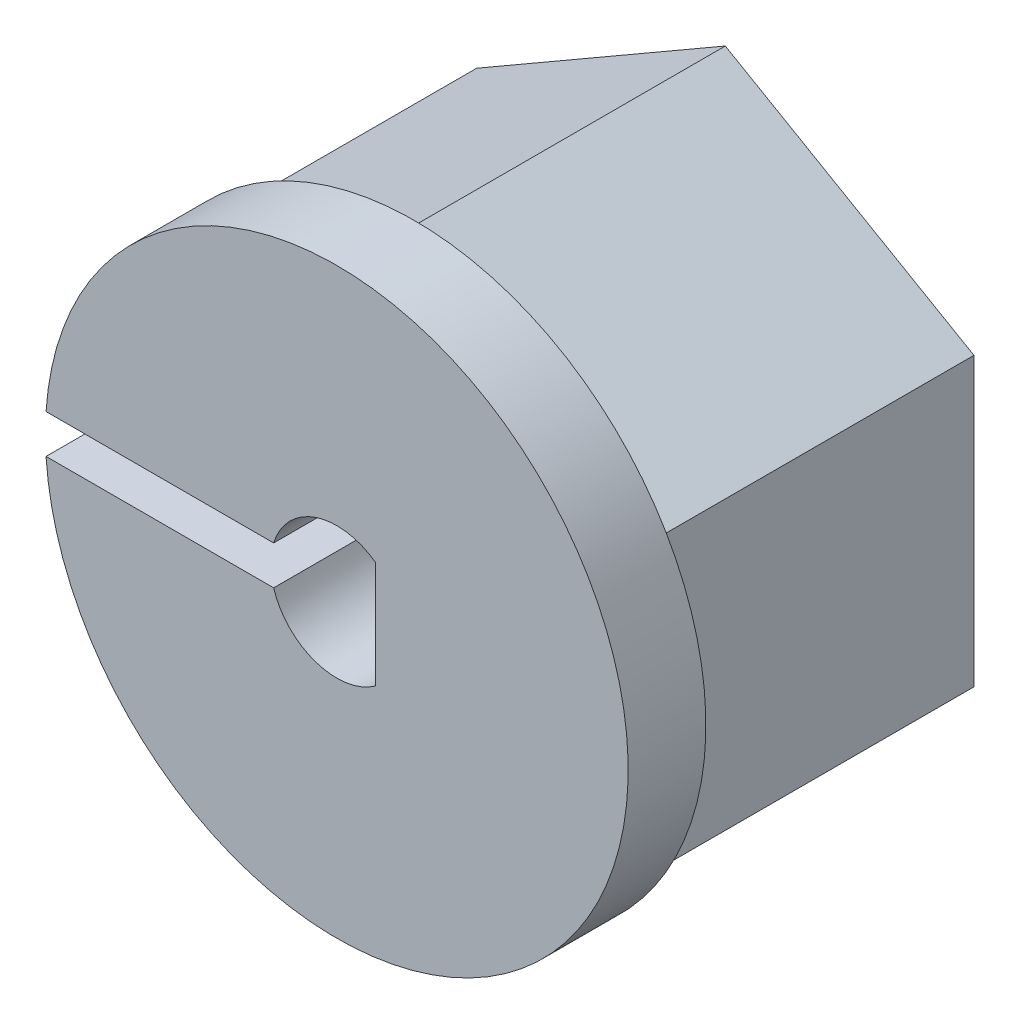
ISO-10303-21;
HEADER;
FILE_DESCRIPTION(('STEP AP214'),'2;1');
FILE_NAME('part.step','',(''),(''),'','','');
FILE_SCHEMA(('AUTOMOTIVE_DESIGN { 1 0 10303 214 1 1 1 1 }'));
ENDSEC;
DATA;
#1=APPLICATION_CONTEXT('core data for automotive mechanical design processes');
#2=APPLICATION_PROTOCOL_DEFINITION('international standard','automotive_design',2000,#1);
#3=PRODUCT_CONTEXT('',#1,'mechanical');
#4=PRODUCT('Part','Part','',(#3));
#5=PRODUCT_RELATED_PRODUCT_CATEGORY('part','',(#4));
#6=PRODUCT_DEFINITION_FORMATION('','',#4);
#7=PRODUCT_DEFINITION_CONTEXT('part definition',#1,'design');
#8=PRODUCT_DEFINITION('design','',#6,#7);
#9=PRODUCT_DEFINITION_SHAPE('','',#8);
#10=(LENGTH_UNIT() NAMED_UNIT(*) SI_UNIT(.MILLI.,.METRE.));
#11=(NAMED_UNIT(*) PLANE_ANGLE_UNIT() SI_UNIT($,.RADIAN.));
#12=(NAMED_UNIT(*) SI_UNIT($,.STERADIAN.) SOLID_ANGLE_UNIT());
#13=UNCERTAINTY_MEASURE_WITH_UNIT(LENGTH_MEASURE(1.E-05),#10,'distance_accuracy_value','');
#14=(GEOMETRIC_REPRESENTATION_CONTEXT(3) GLOBAL_UNCERTAINTY_ASSIGNED_CONTEXT((#13)) GLOBAL_UNIT_ASSIGNED_CONTEXT((#10,
#11,#12)) REPRESENTATION_CONTEXT('',''));
#15=CARTESIAN_POINT('',(0.,0.,0.));
#16=DIRECTION('',(0.,0.,1.));
#17=DIRECTION('',(1.,0.,0.));
#18=AXIS2_PLACEMENT_3D('',#15,#16,#17);
#19=CARTESIAN_POINT('',(-6.4,3.69504172281361,8.));
#20=DIRECTION('',(1.,0.,0.));
#21=DIRECTION('',(0.,1.,0.));
#22=AXIS2_PLACEMENT_3D('',#19,#20,#21);
#23=PLANE('',#22);
#24=DIRECTION('',(0.,-1.,0.));
#25=VECTOR('',#24,1.);
#26=CARTESIAN_POINT('',(-6.4,3.69504172281361,0.));
#27=LINE('',#26,#25);
#28=CARTESIAN_POINT('',(-6.4,3.69504172281361,0.));
#29=VERTEX_POINT('',#28);
#30=CARTESIAN_POINT('',(-6.4,0.5,0.));
#31=VERTEX_POINT('',#30);
#32=EDGE_CURVE('E142',#29,#31,#27,.T.);
#33=ORIENTED_EDGE('',*,*,#32,.T.);
#34=DIRECTION('',(0.,0.,-1.));
#35=VECTOR('',#34,1.);
#36=CARTESIAN_POINT('',(-6.4,0.5,10.001));
#37=LINE('',#36,#35);
#38=CARTESIAN_POINT('',(-6.4,0.5,8.));
#39=VERTEX_POINT('',#38);
#40=EDGE_CURVE('E257',#39,#31,#37,.T.);
#41=ORIENTED_EDGE('',*,*,#40,.F.);
#42=DIRECTION('',(0.,-1.,0.));
#43=VECTOR('',#42,1.);
#44=CARTESIAN_POINT('',(-6.4,3.69504172281361,8.));
#45=LINE('',#44,#43);
#46=CARTESIAN_POINT('',(-6.4,3.69504172281361,8.));
#47=VERTEX_POINT('',#46);
#48=EDGE_CURVE('E114',#47,#39,#45,.T.);
#49=ORIENTED_EDGE('',*,*,#48,.F.);
#50=DIRECTION('',(0.,0.,-1.));
#51=VECTOR('',#50,1.);
#52=CARTESIAN_POINT('',(-6.4,3.69504172281361,8.));
#53=LINE('',#52,#51);
#54=EDGE_CURVE('E40',#47,#29,#53,.T.);
#55=ORIENTED_EDGE('',*,*,#54,.T.);
#56=EDGE_LOOP('',(#33,#41,#49,#55));
#57=FACE_BOUND('',#56,.T.);
#58=ADVANCED_FACE('F32',(#57),#23,.F.);
#59=CARTESIAN_POINT('',(6.4,3.69504172281361,8.));
#60=DIRECTION('',(-0.5,-0.866025403784439,0.));
#61=DIRECTION('',(0.866025403784439,-0.5,0.));
#62=AXIS2_PLACEMENT_3D('',#59,#60,#61);
#63=PLANE('',#62);
#64=DIRECTION('',(-0.866025403784439,0.5,0.));
#65=VECTOR('',#64,1.);
#66=CARTESIAN_POINT('',(6.4,3.69504172281361,0.));
#67=LINE('',#66,#65);
#68=CARTESIAN_POINT('',(6.4,3.69504172281361,0.));
#69=VERTEX_POINT('',#68);
#70=CARTESIAN_POINT('',(0.,7.39008344562721,0.));
#71=VERTEX_POINT('',#70);
#72=EDGE_CURVE('E136',#69,#71,#67,.T.);
#73=ORIENTED_EDGE('',*,*,#72,.T.);
#74=DIRECTION('',(0.,0.,-1.));
#75=VECTOR('',#74,1.);
#76=CARTESIAN_POINT('',(0.,7.39008344562721,8.));
#77=LINE('',#76,#75);
#78=CARTESIAN_POINT('',(0.,7.39008344562721,8.));
#79=VERTEX_POINT('',#78);
#80=EDGE_CURVE('E11',#79,#71,#77,.T.);
#81=ORIENTED_EDGE('',*,*,#80,.F.);
#82=DIRECTION('',(-0.866025403784439,0.5,0.));
#83=VECTOR('',#82,1.);
#84=CARTESIAN_POINT('',(6.4,3.69504172281361,8.));
#85=LINE('',#84,#83);
#86=CARTESIAN_POINT('',(6.4,3.69504172281361,8.));
#87=VERTEX_POINT('',#86);
#88=EDGE_CURVE('E150',#87,#79,#85,.T.);
#89=ORIENTED_EDGE('',*,*,#88,.F.);
#90=DIRECTION('',(0.,0.,-1.));
#91=VECTOR('',#90,1.);
#92=CARTESIAN_POINT('',(6.4,3.69504172281361,8.));
#93=LINE('',#92,#91);
#94=EDGE_CURVE('E135',#87,#69,#93,.T.);
#95=ORIENTED_EDGE('',*,*,#94,.T.);
#96=EDGE_LOOP('',(#73,#81,#89,#95));
#97=FACE_BOUND('',#96,.T.);
#98=ADVANCED_FACE('F34',(#97),#63,.F.);
#99=CARTESIAN_POINT('',(0.,7.39008344562721,8.));
#100=DIRECTION('',(0.5,-0.866025403784439,0.));
#101=DIRECTION('',(0.866025403784439,0.5,0.));
#102=AXIS2_PLACEMENT_3D('',#99,#100,#101);
#103=PLANE('',#102);
#104=DIRECTION('',(-0.866025403784439,-0.5,0.));
#105=VECTOR('',#104,1.);
#106=CARTESIAN_POINT('',(0.,7.39008344562721,0.));
#107=LINE('',#106,#105);
#108=EDGE_CURVE('E139',#71,#29,#107,.T.);
#109=ORIENTED_EDGE('',*,*,#108,.T.);
#110=ORIENTED_EDGE('',*,*,#54,.F.);
#111=DIRECTION('',(-0.866025403784439,-0.5,0.));
#112=VECTOR('',#111,1.);
#113=CARTESIAN_POINT('',(0.,7.39008344562721,8.));
#114=LINE('',#113,#112);
#115=EDGE_CURVE('E91',#79,#47,#114,.T.);
#116=ORIENTED_EDGE('',*,*,#115,.F.);
#117=ORIENTED_EDGE('',*,*,#80,.T.);
#118=EDGE_LOOP('',(#109,#110,#116,#117));
#119=FACE_BOUND('',#118,.T.);
#120=ADVANCED_FACE('F296',(#119),#103,.F.);
#121=CARTESIAN_POINT('',(-6.4,-0.5,8.));
#122=VERTEX_POINT('',#121);
#123=CARTESIAN_POINT('',(-6.4,-3.6950417228136,8.));
#124=VERTEX_POINT('',#123);
#125=EDGE_CURVE('E101',#122,#124,#45,.T.);
#126=ORIENTED_EDGE('',*,*,#125,.F.);
#127=DIRECTION('',(0.,0.,1.));
#128=VECTOR('',#127,1.);
#129=CARTESIAN_POINT('',(-6.4,-0.5,10.001));
#130=LINE('',#129,#128);
#131=CARTESIAN_POINT('',(-6.4,-0.5,0.));
#132=VERTEX_POINT('',#131);
#133=EDGE_CURVE('E275',#132,#122,#130,.T.);
#134=ORIENTED_EDGE('',*,*,#133,.F.);
#135=CARTESIAN_POINT('',(-6.4,-3.6950417228136,0.));
#136=VERTEX_POINT('',#135);
#137=EDGE_CURVE('E120',#132,#136,#27,.T.);
#138=ORIENTED_EDGE('',*,*,#137,.T.);
#139=DIRECTION('',(0.,0.,-1.));
#140=VECTOR('',#139,1.);
#141=CARTESIAN_POINT('',(-6.4,-3.6950417228136,8.));
#142=LINE('',#141,#140);
#143=EDGE_CURVE('E117',#124,#136,#142,.T.);
#144=ORIENTED_EDGE('',*,*,#143,.F.);
#145=EDGE_LOOP('',(#126,#134,#138,#144));
#146=FACE_BOUND('',#145,.T.);
#147=ADVANCED_FACE('F118',(#146),#23,.F.);
#148=CARTESIAN_POINT('',(-6.4,-3.6950417228136,8.));
#149=DIRECTION('',(0.5,0.866025403784439,0.));
#150=DIRECTION('',(-0.866025403784439,0.5,0.));
#151=AXIS2_PLACEMENT_3D('',#148,#149,#150);
#152=PLANE('',#151);
#153=DIRECTION('',(0.866025403784439,-0.5,0.));
#154=VECTOR('',#153,1.);
#155=CARTESIAN_POINT('',(-6.4,-3.6950417228136,0.));
#156=LINE('',#155,#154);
#157=CARTESIAN_POINT('',(0.,-7.39008344562721,0.));
#158=VERTEX_POINT('',#157);
#159=EDGE_CURVE('E145',#136,#158,#156,.T.);
#160=ORIENTED_EDGE('',*,*,#159,.T.);
#161=DIRECTION('',(0.,0.,-1.));
#162=VECTOR('',#161,1.);
#163=CARTESIAN_POINT('',(0.,-7.39008344562721,8.));
#164=LINE('',#163,#162);
#165=CARTESIAN_POINT('',(0.,-7.39008344562721,8.));
#166=VERTEX_POINT('',#165);
#167=EDGE_CURVE('E123',#166,#158,#164,.T.);
#168=ORIENTED_EDGE('',*,*,#167,.F.);
#169=DIRECTION('',(0.866025403784439,-0.5,0.));
#170=VECTOR('',#169,1.);
#171=CARTESIAN_POINT('',(-6.4,-3.6950417228136,8.));
#172=LINE('',#171,#170);
#173=EDGE_CURVE('E107',#124,#166,#172,.T.);
#174=ORIENTED_EDGE('',*,*,#173,.F.);
#175=ORIENTED_EDGE('',*,*,#143,.T.);
#176=EDGE_LOOP('',(#160,#168,#174,#175));
#177=FACE_BOUND('',#176,.T.);
#178=ADVANCED_FACE('F125',(#177),#152,.F.);
#179=CARTESIAN_POINT('',(0.,-7.39008344562721,8.));
#180=DIRECTION('',(-0.5,0.866025403784439,0.));
#181=DIRECTION('',(-0.866025403784439,-0.5,0.));
#182=AXIS2_PLACEMENT_3D('',#179,#180,#181);
#183=PLANE('',#182);
#184=DIRECTION('',(0.866025403784439,0.5,0.));
#185=VECTOR('',#184,1.);
#186=CARTESIAN_POINT('',(0.,-7.39008344562721,0.));
#187=LINE('',#186,#185);
#188=CARTESIAN_POINT('',(6.4,-3.69504172281361,0.));
#189=VERTEX_POINT('',#188);
#190=EDGE_CURVE('E147',#158,#189,#187,.T.);
#191=ORIENTED_EDGE('',*,*,#190,.T.);
#192=DIRECTION('',(0.,0.,-1.));
#193=VECTOR('',#192,1.);
#194=CARTESIAN_POINT('',(6.4,-3.69504172281361,8.));
#195=LINE('',#194,#193);
#196=CARTESIAN_POINT('',(6.4,-3.69504172281361,8.));
#197=VERTEX_POINT('',#196);
#198=EDGE_CURVE('E56',#197,#189,#195,.T.);
#199=ORIENTED_EDGE('',*,*,#198,.F.);
#200=DIRECTION('',(0.866025403784439,0.5,0.));
#201=VECTOR('',#200,1.);
#202=CARTESIAN_POINT('',(0.,-7.39008344562721,8.));
#203=LINE('',#202,#201);
#204=EDGE_CURVE('E127',#166,#197,#203,.T.);
#205=ORIENTED_EDGE('',*,*,#204,.F.);
#206=ORIENTED_EDGE('',*,*,#167,.T.);
#207=EDGE_LOOP('',(#191,#199,#205,#206));
#208=FACE_BOUND('',#207,.T.);
#209=ADVANCED_FACE('F217',(#208),#183,.F.);
#210=CARTESIAN_POINT('',(6.4,-3.69504172281361,8.));
#211=DIRECTION('',(-1.,0.,0.));
#212=DIRECTION('',(0.,-1.,0.));
#213=AXIS2_PLACEMENT_3D('',#210,#211,#212);
#214=PLANE('',#213);
#215=DIRECTION('',(0.,1.,0.));
#216=VECTOR('',#215,1.);
#217=CARTESIAN_POINT('',(6.4,-3.69504172281361,0.));
#218=LINE('',#217,#216);
#219=EDGE_CURVE('E83',#189,#69,#218,.T.);
#220=ORIENTED_EDGE('',*,*,#219,.T.);
#221=ORIENTED_EDGE('',*,*,#94,.F.);
#222=DIRECTION('',(0.,1.,0.));
#223=VECTOR('',#222,1.);
#224=CARTESIAN_POINT('',(6.4,-3.69504172281361,8.));
#225=LINE('',#224,#223);
#226=EDGE_CURVE('E129',#197,#87,#225,.T.);
#227=ORIENTED_EDGE('',*,*,#226,.F.);
#228=ORIENTED_EDGE('',*,*,#198,.T.);
#229=EDGE_LOOP('',(#220,#221,#227,#228));
#230=FACE_BOUND('',#229,.T.);
#231=ADVANCED_FACE('F216',(#230),#214,.F.);
#232=CARTESIAN_POINT('',(0.,0.,0.));
#233=DIRECTION('',(0.,0.,1.));
#234=DIRECTION('',(1.,0.,0.));
#235=AXIS2_PLACEMENT_3D('',#232,#233,#234);
#236=PLANE('',#235);
#237=CARTESIAN_POINT('',(0.,0.,0.));
#238=DIRECTION('',(0.,0.,-1.));
#239=DIRECTION('',(-1.,0.,0.));
#240=AXIS2_PLACEMENT_3D('',#237,#238,#239);
#241=CIRCLE('',#240,1.7);
#242=CARTESIAN_POINT('',(-1.62480768092719,0.5,0.));
#243=VERTEX_POINT('',#242);
#244=CARTESIAN_POINT('',(1.,1.37477270848675,0.));
#245=VERTEX_POINT('',#244);
#246=EDGE_CURVE('E169',#243,#245,#241,.T.);
#247=ORIENTED_EDGE('',*,*,#246,.F.);
#248=DIRECTION('',(1.,0.,0.));
#249=VECTOR('',#248,1.);
#250=CARTESIAN_POINT('',(-1.62480768092719,0.5,0.));
#251=LINE('',#250,#249);
#252=EDGE_CURVE('E165',#31,#243,#251,.T.);
#253=ORIENTED_EDGE('',*,*,#252,.F.);
#254=ORIENTED_EDGE('',*,*,#32,.F.);
#255=ORIENTED_EDGE('',*,*,#108,.F.);
#256=ORIENTED_EDGE('',*,*,#72,.F.);
#257=ORIENTED_EDGE('',*,*,#219,.F.);
#258=ORIENTED_EDGE('',*,*,#190,.F.);
#259=ORIENTED_EDGE('',*,*,#159,.F.);
#260=ORIENTED_EDGE('',*,*,#137,.F.);
#261=DIRECTION('',(-1.,0.,0.));
#262=VECTOR('',#261,1.);
#263=CARTESIAN_POINT('',(-1.62480768092719,-0.5,0.));
#264=LINE('',#263,#262);
#265=CARTESIAN_POINT('',(-1.62480768092719,-0.5,0.));
#266=VERTEX_POINT('',#265);
#267=EDGE_CURVE('E176',#266,#132,#264,.T.);
#268=ORIENTED_EDGE('',*,*,#267,.F.);
#269=CARTESIAN_POINT('',(0.,0.,0.));
#270=DIRECTION('',(0.,0.,-1.));
#271=DIRECTION('',(-1.,0.,0.));
#272=AXIS2_PLACEMENT_3D('',#269,#270,#271);
#273=CIRCLE('',#272,1.7);
#274=CARTESIAN_POINT('',(1.,-1.37477270848675,0.));
#275=VERTEX_POINT('',#274);
#276=EDGE_CURVE('E181',#275,#266,#273,.T.);
#277=ORIENTED_EDGE('',*,*,#276,.F.);
#278=DIRECTION('',(0.,-1.,0.));
#279=VECTOR('',#278,1.);
#280=CARTESIAN_POINT('',(1.,1.37477270848675,0.));
#281=LINE('',#280,#279);
#282=EDGE_CURVE('E178',#245,#275,#281,.T.);
#283=ORIENTED_EDGE('',*,*,#282,.F.);
#284=EDGE_LOOP('',(#247,#253,#254,#255,#256,#257,#258,#259,#260,#268,#277,#283));
#285=FACE_BOUND('',#284,.T.);
#286=ADVANCED_FACE('F162',(#285),#236,.F.);
#287=CARTESIAN_POINT('',(0.,0.,8.));
#288=DIRECTION('',(0.,0.,1.));
#289=DIRECTION('',(1.,0.,0.));
#290=AXIS2_PLACEMENT_3D('',#287,#288,#289);
#291=PLANE('',#290);
#292=ORIENTED_EDGE('',*,*,#48,.T.);
#293=DIRECTION('',(1.,0.,0.));
#294=VECTOR('',#293,1.);
#295=CARTESIAN_POINT('',(-1.62480768092719,0.5,8.));
#296=LINE('',#295,#294);
#297=CARTESIAN_POINT('',(-7.48331477354788,0.5,8.));
#298=VERTEX_POINT('',#297);
#299=EDGE_CURVE('E272',#298,#39,#296,.T.);
#300=ORIENTED_EDGE('',*,*,#299,.F.);
#301=CARTESIAN_POINT('',(0.,0.,8.));
#302=DIRECTION('',(0.,0.,1.));
#303=DIRECTION('',(1.,0.,0.));
#304=AXIS2_PLACEMENT_3D('',#301,#302,#303);
#305=CIRCLE('',#304,7.5);
#306=CARTESIAN_POINT('',(-7.48331477354788,-0.5,8.));
#307=VERTEX_POINT('',#306);
#308=EDGE_CURVE('E205',#307,#298,#305,.T.);
#309=ORIENTED_EDGE('',*,*,#308,.F.);
#310=DIRECTION('',(-1.,0.,0.));
#311=VECTOR('',#310,1.);
#312=CARTESIAN_POINT('',(-1.62480768092719,-0.5,8.));
#313=LINE('',#312,#311);
#314=EDGE_CURVE('E111',#122,#307,#313,.T.);
#315=ORIENTED_EDGE('',*,*,#314,.F.);
#316=ORIENTED_EDGE('',*,*,#125,.T.);
#317=ORIENTED_EDGE('',*,*,#173,.T.);
#318=ORIENTED_EDGE('',*,*,#204,.T.);
#319=ORIENTED_EDGE('',*,*,#226,.T.);
#320=ORIENTED_EDGE('',*,*,#88,.T.);
#321=ORIENTED_EDGE('',*,*,#115,.T.);
#322=EDGE_LOOP('',(#292,#300,#309,#315,#316,#317,#318,#319,#320,#321));
#323=FACE_BOUND('',#322,.T.);
#324=ADVANCED_FACE('F104',(#323),#291,.F.);
#325=CARTESIAN_POINT('',(0.,0.,10.));
#326=DIRECTION('',(0.,0.,-1.));
#327=DIRECTION('',(-1.,0.,0.));
#328=AXIS2_PLACEMENT_3D('',#325,#326,#327);
#329=CYLINDRICAL_SURFACE('',#328,7.5);
#330=ORIENTED_EDGE('',*,*,#308,.T.);
#331=DIRECTION('',(0.,0.,-1.));
#332=VECTOR('',#331,1.);
#333=CARTESIAN_POINT('',(-7.48331477354788,0.5,10.));
#334=LINE('',#333,#332);
#335=CARTESIAN_POINT('',(-7.48331477354788,0.5,10.));
#336=VERTEX_POINT('',#335);
#337=EDGE_CURVE('E270',#336,#298,#334,.T.);
#338=ORIENTED_EDGE('',*,*,#337,.F.);
#339=CARTESIAN_POINT('',(0.,0.,10.));
#340=DIRECTION('',(0.,0.,1.));
#341=DIRECTION('',(1.,0.,0.));
#342=AXIS2_PLACEMENT_3D('',#339,#340,#341);
#343=CIRCLE('',#342,7.5);
#344=CARTESIAN_POINT('',(-7.48331477354788,-0.5,10.));
#345=VERTEX_POINT('',#344);
#346=EDGE_CURVE('E140',#345,#336,#343,.T.);
#347=ORIENTED_EDGE('',*,*,#346,.F.);
#348=DIRECTION('',(0.,0.,-1.));
#349=VECTOR('',#348,1.);
#350=CARTESIAN_POINT('',(-7.48331477354788,-0.5,10.));
#351=LINE('',#350,#349);
#352=EDGE_CURVE('E201',#307,#345,#351,.F.);
#353=ORIENTED_EDGE('',*,*,#352,.F.);
#354=EDGE_LOOP('',(#330,#338,#347,#353));
#355=FACE_BOUND('',#354,.T.);
#356=ADVANCED_FACE('F281',(#355),#329,.T.);
#357=CARTESIAN_POINT('',(0.,0.,10.));
#358=DIRECTION('',(0.,0.,1.));
#359=DIRECTION('',(1.,0.,0.));
#360=AXIS2_PLACEMENT_3D('',#357,#358,#359);
#361=PLANE('',#360);
#362=DIRECTION('',(1.,0.,0.));
#363=VECTOR('',#362,1.);
#364=CARTESIAN_POINT('',(-1.62480768092719,0.5,10.));
#365=LINE('',#364,#363);
#366=CARTESIAN_POINT('',(-1.62480768092719,0.5,10.));
#367=VERTEX_POINT('',#366);
#368=EDGE_CURVE('E265',#336,#367,#365,.T.);
#369=ORIENTED_EDGE('',*,*,#368,.T.);
#370=CARTESIAN_POINT('',(0.,0.,10.));
#371=DIRECTION('',(0.,0.,1.));
#372=DIRECTION('',(1.,0.,0.));
#373=AXIS2_PLACEMENT_3D('',#370,#371,#372);
#374=CIRCLE('',#373,1.7);
#375=CARTESIAN_POINT('',(1.,1.37477270848675,10.));
#376=VERTEX_POINT('',#375);
#377=EDGE_CURVE('E263',#367,#376,#374,.F.);
#378=ORIENTED_EDGE('',*,*,#377,.T.);
#379=DIRECTION('',(0.,-1.,0.));
#380=VECTOR('',#379,1.);
#381=CARTESIAN_POINT('',(1.,1.37477270848675,10.));
#382=LINE('',#381,#380);
#383=CARTESIAN_POINT('',(1.,-1.37477270848675,10.));
#384=VERTEX_POINT('',#383);
#385=EDGE_CURVE('E47',#376,#384,#382,.T.);
#386=ORIENTED_EDGE('',*,*,#385,.T.);
#387=CARTESIAN_POINT('',(0.,0.,10.));
#388=DIRECTION('',(0.,0.,1.));
#389=DIRECTION('',(1.,0.,0.));
#390=AXIS2_PLACEMENT_3D('',#387,#388,#389);
#391=CIRCLE('',#390,1.7);
#392=CARTESIAN_POINT('',(-1.62480768092719,-0.5,10.));
#393=VERTEX_POINT('',#392);
#394=EDGE_CURVE('E253',#384,#393,#391,.F.);
#395=ORIENTED_EDGE('',*,*,#394,.T.);
#396=DIRECTION('',(-1.,0.,0.));
#397=VECTOR('',#396,1.);
#398=CARTESIAN_POINT('',(-1.62480768092719,-0.5,10.));
#399=LINE('',#398,#397);
#400=EDGE_CURVE('E191',#393,#345,#399,.T.);
#401=ORIENTED_EDGE('',*,*,#400,.T.);
#402=ORIENTED_EDGE('',*,*,#346,.T.);
#403=EDGE_LOOP('',(#369,#378,#386,#395,#401,#402));
#404=FACE_BOUND('',#403,.T.);
#405=ADVANCED_FACE('F261',(#404),#361,.T.);
#406=CARTESIAN_POINT('',(-1.62480768092719,0.5,10.001));
#407=DIRECTION('',(0.,1.,0.));
#408=DIRECTION('',(0.,0.,1.));
#409=AXIS2_PLACEMENT_3D('',#406,#407,#408);
#410=PLANE('',#409);
#411=ORIENTED_EDGE('',*,*,#40,.T.);
#412=ORIENTED_EDGE('',*,*,#252,.T.);
#413=DIRECTION('',(0.,0.,-1.));
#414=VECTOR('',#413,1.);
#415=CARTESIAN_POINT('',(-1.62480768092719,0.5,10.001));
#416=LINE('',#415,#414);
#417=EDGE_CURVE('E194',#367,#243,#416,.T.);
#418=ORIENTED_EDGE('',*,*,#417,.F.);
#419=ORIENTED_EDGE('',*,*,#368,.F.);
#420=ORIENTED_EDGE('',*,*,#337,.T.);
#421=ORIENTED_EDGE('',*,*,#299,.T.);
#422=EDGE_LOOP('',(#411,#412,#418,#419,#420,#421));
#423=FACE_BOUND('',#422,.T.);
#424=ADVANCED_FACE('F273',(#423),#410,.F.);
#425=CARTESIAN_POINT('',(-1.62480768092719,-0.5,10.001));
#426=DIRECTION('',(0.,-1.,0.));
#427=DIRECTION('',(0.,0.,-1.));
#428=AXIS2_PLACEMENT_3D('',#425,#426,#427);
#429=PLANE('',#428);
#430=ORIENTED_EDGE('',*,*,#133,.T.);
#431=ORIENTED_EDGE('',*,*,#314,.T.);
#432=ORIENTED_EDGE('',*,*,#352,.T.);
#433=ORIENTED_EDGE('',*,*,#400,.F.);
#434=DIRECTION('',(0.,0.,-1.));
#435=VECTOR('',#434,1.);
#436=CARTESIAN_POINT('',(-1.62480768092719,-0.5,10.001));
#437=LINE('',#436,#435);
#438=EDGE_CURVE('E187',#393,#266,#437,.T.);
#439=ORIENTED_EDGE('',*,*,#438,.T.);
#440=ORIENTED_EDGE('',*,*,#267,.T.);
#441=EDGE_LOOP('',(#430,#431,#432,#433,#439,#440));
#442=FACE_BOUND('',#441,.T.);
#443=ADVANCED_FACE('F277',(#442),#429,.F.);
#444=CARTESIAN_POINT('',(0.,0.,10.001));
#445=DIRECTION('',(0.,0.,-1.));
#446=DIRECTION('',(-1.,0.,0.));
#447=AXIS2_PLACEMENT_3D('',#444,#445,#446);
#448=CYLINDRICAL_SURFACE('',#447,1.7);
#449=DIRECTION('',(0.,0.,-1.));
#450=VECTOR('',#449,1.);
#451=CARTESIAN_POINT('',(1.,-1.37477270848675,10.001));
#452=LINE('',#451,#450);
#453=EDGE_CURVE('E188',#384,#275,#452,.T.);
#454=ORIENTED_EDGE('',*,*,#453,.T.);
#455=ORIENTED_EDGE('',*,*,#276,.T.);
#456=ORIENTED_EDGE('',*,*,#438,.F.);
#457=ORIENTED_EDGE('',*,*,#394,.F.);
#458=EDGE_LOOP('',(#454,#455,#456,#457));
#459=FACE_BOUND('',#458,.T.);
#460=ADVANCED_FACE('F254',(#459),#448,.F.);
#461=CARTESIAN_POINT('',(1.,1.37477270848675,10.001));
#462=DIRECTION('',(1.,0.,0.));
#463=DIRECTION('',(0.,0.,-1.));
#464=AXIS2_PLACEMENT_3D('',#461,#462,#463);
#465=PLANE('',#464);
#466=DIRECTION('',(0.,0.,-1.));
#467=VECTOR('',#466,1.);
#468=CARTESIAN_POINT('',(1.,1.37477270848675,10.001));
#469=LINE('',#468,#467);
#470=EDGE_CURVE('E192',#376,#245,#469,.T.);
#471=ORIENTED_EDGE('',*,*,#470,.T.);
#472=ORIENTED_EDGE('',*,*,#282,.T.);
#473=ORIENTED_EDGE('',*,*,#453,.F.);
#474=ORIENTED_EDGE('',*,*,#385,.F.);
#475=EDGE_LOOP('',(#471,#472,#473,#474));
#476=FACE_BOUND('',#475,.T.);
#477=ADVANCED_FACE('F249',(#476),#465,.F.);
#478=CARTESIAN_POINT('',(0.,0.,10.001));
#479=DIRECTION('',(0.,0.,-1.));
#480=DIRECTION('',(-1.,0.,0.));
#481=AXIS2_PLACEMENT_3D('',#478,#479,#480);
#482=CYLINDRICAL_SURFACE('',#481,1.7);
#483=ORIENTED_EDGE('',*,*,#417,.T.);
#484=ORIENTED_EDGE('',*,*,#246,.T.);
#485=ORIENTED_EDGE('',*,*,#470,.F.);
#486=ORIENTED_EDGE('',*,*,#377,.F.);
#487=EDGE_LOOP('',(#483,#484,#485,#486));
#488=FACE_BOUND('',#487,.T.);
#489=ADVANCED_FACE('F283',(#488),#482,.F.);
#490=CLOSED_SHELL('',(#58,#98,#120,#147,#178,#209,#231,#286,#324,#356,#405,#424,#443,#460,#477,#489));
#491=MANIFOLD_SOLID_BREP('B2',#490);
#492=ADVANCED_BREP_SHAPE_REPRESENTATION('',(#18,#491),#14);
#493=SHAPE_DEFINITION_REPRESENTATION(#9,#492);
ENDSEC;
END-ISO-10303-21;
